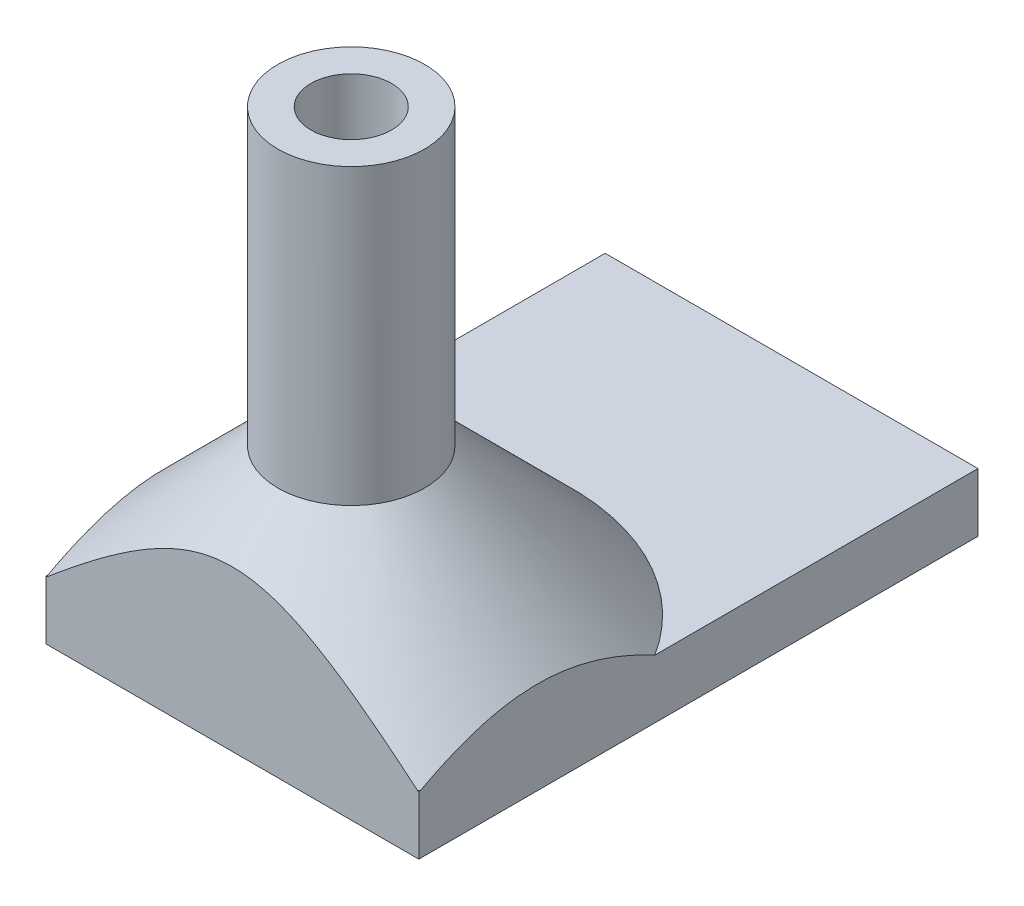
ISO-10303-21;
HEADER;
FILE_DESCRIPTION(('STEP AP214'),'2;1');
FILE_NAME('part.step','',(''),(''),'','','');
FILE_SCHEMA(('AUTOMOTIVE_DESIGN { 1 0 10303 214 1 1 1 1 }'));
ENDSEC;
DATA;
#1=APPLICATION_CONTEXT('core data for automotive mechanical design processes');
#2=APPLICATION_PROTOCOL_DEFINITION('international standard','automotive_design',2000,#1);
#3=PRODUCT_CONTEXT('',#1,'mechanical');
#4=PRODUCT('Part','Part','',(#3));
#5=PRODUCT_RELATED_PRODUCT_CATEGORY('part','',(#4));
#6=PRODUCT_DEFINITION_FORMATION('','',#4);
#7=PRODUCT_DEFINITION_CONTEXT('part definition',#1,'design');
#8=PRODUCT_DEFINITION('design','',#6,#7);
#9=PRODUCT_DEFINITION_SHAPE('','',#8);
#10=(LENGTH_UNIT() NAMED_UNIT(*) SI_UNIT(.MILLI.,.METRE.));
#11=(NAMED_UNIT(*) PLANE_ANGLE_UNIT() SI_UNIT($,.RADIAN.));
#12=(NAMED_UNIT(*) SI_UNIT($,.STERADIAN.) SOLID_ANGLE_UNIT());
#13=UNCERTAINTY_MEASURE_WITH_UNIT(LENGTH_MEASURE(1.E-05),#10,'distance_accuracy_value','');
#14=(GEOMETRIC_REPRESENTATION_CONTEXT(3) GLOBAL_UNCERTAINTY_ASSIGNED_CONTEXT((#13)) GLOBAL_UNIT_ASSIGNED_CONTEXT((#10,
#11,#12)) REPRESENTATION_CONTEXT('',''));
#15=CARTESIAN_POINT('',(0.,0.,0.));
#16=DIRECTION('',(0.,0.,1.));
#17=DIRECTION('',(1.,0.,0.));
#18=AXIS2_PLACEMENT_3D('',#15,#16,#17);
#19=CARTESIAN_POINT('',(0.,4.,0.));
#20=DIRECTION('',(0.,1.,0.));
#21=DIRECTION('',(0.,0.,1.));
#22=AXIS2_PLACEMENT_3D('',#19,#20,#21);
#23=PLANE('',#22);
#24=DIRECTION('',(1.,0.,0.));
#25=VECTOR('',#24,1.);
#26=CARTESIAN_POINT('',(-12.7,4.,19.05));
#27=LINE('',#26,#25);
#28=CARTESIAN_POINT('',(-12.7,4.,19.05));
#29=VERTEX_POINT('',#28);
#30=CARTESIAN_POINT('',(-12.6270183866441,4.,19.05));
#31=VERTEX_POINT('',#30);
#32=EDGE_CURVE('E182',#29,#31,#27,.T.);
#33=ORIENTED_EDGE('',*,*,#32,.T.);
#34=CARTESIAN_POINT('',(0.,4.,10.9531854002114));
#35=DIRECTION('',(0.,1.,0.));
#36=DIRECTION('',(0.,0.,1.));
#37=AXIS2_PLACEMENT_3D('',#34,#35,#36);
#38=CIRCLE('',#37,15.);
#39=CARTESIAN_POINT('',(-12.7,4.,18.9350398213343));
#40=VERTEX_POINT('',#39);
#41=EDGE_CURVE('E134',#31,#40,#38,.F.);
#42=ORIENTED_EDGE('',*,*,#41,.T.);
#43=DIRECTION('',(0.,0.,1.));
#44=VECTOR('',#43,1.);
#45=CARTESIAN_POINT('',(-12.7,4.,-19.05));
#46=LINE('',#45,#44);
#47=EDGE_CURVE('E118',#40,#29,#46,.T.);
#48=ORIENTED_EDGE('',*,*,#47,.T.);
#49=EDGE_LOOP('',(#33,#42,#48));
#50=FACE_BOUND('',#49,.T.);
#51=ADVANCED_FACE('F33',(#50),#23,.T.);
#52=CARTESIAN_POINT('',(-12.7,4.,-19.05));
#53=VERTEX_POINT('',#52);
#54=CARTESIAN_POINT('',(-12.7,4.,2.97133097908851));
#55=VERTEX_POINT('',#54);
#56=EDGE_CURVE('E184',#53,#55,#46,.T.);
#57=ORIENTED_EDGE('',*,*,#56,.T.);
#58=CARTESIAN_POINT('',(0.,4.,10.9531854002114));
#59=DIRECTION('',(0.,1.,0.));
#60=DIRECTION('',(0.,0.,1.));
#61=AXIS2_PLACEMENT_3D('',#58,#59,#60);
#62=CIRCLE('',#61,15.);
#63=CARTESIAN_POINT('',(12.7,4.,2.97133097908851));
#64=VERTEX_POINT('',#63);
#65=EDGE_CURVE('E103',#55,#64,#62,.F.);
#66=ORIENTED_EDGE('',*,*,#65,.T.);
#67=DIRECTION('',(0.,0.,-1.));
#68=VECTOR('',#67,1.);
#69=CARTESIAN_POINT('',(12.7,4.,-19.05));
#70=LINE('',#69,#68);
#71=CARTESIAN_POINT('',(12.7,4.,-19.05));
#72=VERTEX_POINT('',#71);
#73=EDGE_CURVE('E96',#64,#72,#70,.T.);
#74=ORIENTED_EDGE('',*,*,#73,.T.);
#75=DIRECTION('',(-1.,0.,0.));
#76=VECTOR('',#75,1.);
#77=CARTESIAN_POINT('',(-12.7,4.,-19.05));
#78=LINE('',#77,#76);
#79=EDGE_CURVE('E100',#72,#53,#78,.T.);
#80=ORIENTED_EDGE('',*,*,#79,.T.);
#81=EDGE_LOOP('',(#57,#66,#74,#80));
#82=FACE_BOUND('',#81,.T.);
#83=ADVANCED_FACE('F99',(#82),#23,.T.);
#84=CARTESIAN_POINT('',(12.7,4.,-19.05));
#85=DIRECTION('',(-1.,0.,0.));
#86=DIRECTION('',(0.,0.,1.));
#87=AXIS2_PLACEMENT_3D('',#84,#85,#86);
#88=PLANE('',#87);
#89=DIRECTION('',(0.,0.,-1.));
#90=VECTOR('',#89,1.);
#91=CARTESIAN_POINT('',(12.7,0.,-19.05));
#92=LINE('',#91,#90);
#93=CARTESIAN_POINT('',(12.7,0.,19.05));
#94=VERTEX_POINT('',#93);
#95=CARTESIAN_POINT('',(12.7,0.,-19.05));
#96=VERTEX_POINT('',#95);
#97=EDGE_CURVE('E123',#94,#96,#92,.T.);
#98=ORIENTED_EDGE('',*,*,#97,.T.);
#99=DIRECTION('',(0.,-1.,0.));
#100=VECTOR('',#99,1.);
#101=CARTESIAN_POINT('',(12.7,4.,-19.05));
#102=LINE('',#101,#100);
#103=EDGE_CURVE('E113',#72,#96,#102,.T.);
#104=ORIENTED_EDGE('',*,*,#103,.F.);
#105=ORIENTED_EDGE('',*,*,#73,.F.);
#106=CARTESIAN_POINT('',(12.7,4.,2.97133097908851));
#107=CARTESIAN_POINT('',(12.7,4.11879831329429,3.19461421196744));
#108=CARTESIAN_POINT('',(12.7,4.23484506345828,3.41938427218611));
#109=CARTESIAN_POINT('',(12.7,4.4606554763704,3.87214172238079));
#110=CARTESIAN_POINT('',(12.7,4.57041717480401,4.1001300907464));
#111=CARTESIAN_POINT('',(12.7,4.78321780729828,4.56032703695149));
#112=CARTESIAN_POINT('',(12.7,4.88622878144901,4.79254862896782));
#113=CARTESIAN_POINT('',(12.7,5.08407999046719,5.26040113205321));
#114=CARTESIAN_POINT('',(12.7,5.178920916533,5.49603175273953));
#115=CARTESIAN_POINT('',(12.7,5.4485923024589,6.20544051850337));
#116=CARTESIAN_POINT('',(12.7,5.60990459683791,6.68456374447272));
#117=CARTESIAN_POINT('',(12.7,5.81773263879009,7.41253771235371));
#118=CARTESIAN_POINT('',(12.7,5.88129100265059,7.65659645744167));
#119=CARTESIAN_POINT('',(12.7,5.99598908895247,8.14760297454775));
#120=CARTESIAN_POINT('',(12.7,6.04713021106915,8.39455041765867));
#121=CARTESIAN_POINT('',(12.7,6.15862033107275,9.01752801523559));
#122=CARTESIAN_POINT('',(12.7,6.21035977359965,9.39514855504708));
#123=CARTESIAN_POINT('',(12.7,6.28045307895177,10.1535477725309));
#124=CARTESIAN_POINT('',(12.7,6.29880286671071,10.5343268299908));
#125=CARTESIAN_POINT('',(12.7,6.30108322360981,11.2959738274899));
#126=CARTESIAN_POINT('',(12.7,6.28501523629468,11.6768417631315));
#127=CARTESIAN_POINT('',(12.7,6.21936226932965,12.4356039165059));
#128=CARTESIAN_POINT('',(12.7,6.16978168115436,12.8134985173003));
#129=CARTESIAN_POINT('',(12.7,6.06117384482156,13.4400936613952));
#130=CARTESIAN_POINT('',(12.7,6.01064918014109,13.690315805911));
#131=CARTESIAN_POINT('',(12.7,5.89678162829107,14.1878358858792));
#132=CARTESIAN_POINT('',(12.7,5.83343735818068,14.4351335027933));
#133=CARTESIAN_POINT('',(12.7,5.62568871144362,15.1727823582914));
#134=CARTESIAN_POINT('',(12.7,5.46368399317052,15.6582535475034));
#135=CARTESIAN_POINT('',(12.7,5.19207197317861,16.3770784873046));
#136=CARTESIAN_POINT('',(12.7,5.09639541647257,16.6159129313349));
#137=CARTESIAN_POINT('',(12.7,4.89662087872876,17.0900822798772));
#138=CARTESIAN_POINT('',(12.7,4.79252215091557,17.3254168718701));
#139=CARTESIAN_POINT('',(12.7,4.57735946998957,17.7916949650412));
#140=CARTESIAN_POINT('',(12.7,4.46632560661088,18.0226524450129));
#141=CARTESIAN_POINT('',(12.7,4.23780014269328,18.4812608954981));
#142=CARTESIAN_POINT('',(12.7,4.12031065229029,18.7089129160598));
#143=CARTESIAN_POINT('',(12.7,4.,18.9350398213343));
#144=B_SPLINE_CURVE_WITH_KNOTS('',3,(#106,#107,#108,#109,#110,#111,#112,#113,#114,#115,#116,
#117,#118,#119,#120,#121,#122,#123,#124,#125,#126,#127,#128,#129,#130,#131,#132,#133,#134,#135,
#136,#137,#138,#139,#140,#141,#142,#143),.UNSPECIFIED.,.F.,.F.,(4,2,2,2,2,2,2,2,2,2,2,2,2,2,2,2,
2,2,4),(0.,0.758768175132964,1.51777221376502,2.27974354303531,3.04165034494511,
4.55610413540636,5.31243480913116,6.06868018941054,7.21067700994493,8.35281319701974,
9.49490148174295,10.6368401367894,11.4023221009696,12.1678866871238,13.7009468957224,
14.4727026044536,15.2445268182218,16.0132080396626,16.7816394816873),.UNSPECIFIED.);
#145=CARTESIAN_POINT('',(12.7,4.,18.9350398213343));
#146=VERTEX_POINT('',#145);
#147=EDGE_CURVE('E46',#64,#146,#144,.T.);
#148=ORIENTED_EDGE('',*,*,#147,.T.);
#149=CARTESIAN_POINT('',(12.7,4.,19.05));
#150=VERTEX_POINT('',#149);
#151=EDGE_CURVE('E107',#150,#146,#70,.T.);
#152=ORIENTED_EDGE('',*,*,#151,.F.);
#153=DIRECTION('',(0.,-1.,0.));
#154=VECTOR('',#153,1.);
#155=CARTESIAN_POINT('',(12.7,4.,19.05));
#156=LINE('',#155,#154);
#157=EDGE_CURVE('E188',#150,#94,#156,.T.);
#158=ORIENTED_EDGE('',*,*,#157,.T.);
#159=EDGE_LOOP('',(#98,#104,#105,#148,#152,#158));
#160=FACE_BOUND('',#159,.T.);
#161=ADVANCED_FACE('F120',(#160),#88,.F.);
#162=CARTESIAN_POINT('',(-12.7,4.,-19.05));
#163=DIRECTION('',(0.,0.,1.));
#164=DIRECTION('',(1.,0.,0.));
#165=AXIS2_PLACEMENT_3D('',#162,#163,#164);
#166=PLANE('',#165);
#167=DIRECTION('',(-1.,0.,0.));
#168=VECTOR('',#167,1.);
#169=CARTESIAN_POINT('',(-12.7,0.,-19.05));
#170=LINE('',#169,#168);
#171=CARTESIAN_POINT('',(-12.7,0.,-19.05));
#172=VERTEX_POINT('',#171);
#173=EDGE_CURVE('E190',#96,#172,#170,.T.);
#174=ORIENTED_EDGE('',*,*,#173,.T.);
#175=DIRECTION('',(0.,-1.,0.));
#176=VECTOR('',#175,1.);
#177=CARTESIAN_POINT('',(-12.7,4.,-19.05));
#178=LINE('',#177,#176);
#179=EDGE_CURVE('E116',#53,#172,#178,.T.);
#180=ORIENTED_EDGE('',*,*,#179,.F.);
#181=ORIENTED_EDGE('',*,*,#79,.F.);
#182=ORIENTED_EDGE('',*,*,#103,.T.);
#183=EDGE_LOOP('',(#174,#180,#181,#182));
#184=FACE_BOUND('',#183,.T.);
#185=ADVANCED_FACE('F112',(#184),#166,.F.);
#186=CARTESIAN_POINT('',(-12.7,4.,-19.05));
#187=DIRECTION('',(1.,0.,0.));
#188=DIRECTION('',(0.,0.,-1.));
#189=AXIS2_PLACEMENT_3D('',#186,#187,#188);
#190=PLANE('',#189);
#191=DIRECTION('',(0.,0.,1.));
#192=VECTOR('',#191,1.);
#193=CARTESIAN_POINT('',(-12.7,0.,-19.05));
#194=LINE('',#193,#192);
#195=CARTESIAN_POINT('',(-12.7,0.,19.05));
#196=VERTEX_POINT('',#195);
#197=EDGE_CURVE('E193',#172,#196,#194,.T.);
#198=ORIENTED_EDGE('',*,*,#197,.T.);
#199=DIRECTION('',(0.,-1.,0.));
#200=VECTOR('',#199,1.);
#201=CARTESIAN_POINT('',(-12.7,4.,19.05));
#202=LINE('',#201,#200);
#203=EDGE_CURVE('E128',#29,#196,#202,.T.);
#204=ORIENTED_EDGE('',*,*,#203,.F.);
#205=ORIENTED_EDGE('',*,*,#47,.F.);
#206=CARTESIAN_POINT('',(-12.7,4.,18.9350398213343));
#207=CARTESIAN_POINT('',(-12.7,4.11879831329429,18.7117565884554));
#208=CARTESIAN_POINT('',(-12.7,4.23484506345828,18.4869865282367));
#209=CARTESIAN_POINT('',(-12.7,4.4606554763704,18.034229078042));
#210=CARTESIAN_POINT('',(-12.7,4.57041717480402,17.8062407096764));
#211=CARTESIAN_POINT('',(-12.7,4.78321780729828,17.3460437634713));
#212=CARTESIAN_POINT('',(-12.7,4.88622878144902,17.113822171455));
#213=CARTESIAN_POINT('',(-12.7,5.08407999046719,16.6459696683696));
#214=CARTESIAN_POINT('',(-12.7,5.178920916533,16.4103390476833));
#215=CARTESIAN_POINT('',(-12.7,5.4485923024589,15.7009302819194));
#216=CARTESIAN_POINT('',(-12.7,5.60990459683791,15.2218070559501));
#217=CARTESIAN_POINT('',(-12.7,5.8177326387901,14.4938330880691));
#218=CARTESIAN_POINT('',(-12.7,5.88129100265059,14.2497743429811));
#219=CARTESIAN_POINT('',(-12.7,5.99598908895247,13.758767825875));
#220=CARTESIAN_POINT('',(-12.7,6.04713021106915,13.5118203827641));
#221=CARTESIAN_POINT('',(-12.7,6.15862033107275,12.8888427851872));
#222=CARTESIAN_POINT('',(-12.7,6.21035977359966,12.5112222453757));
#223=CARTESIAN_POINT('',(-12.7,6.28045307895177,11.7528230278919));
#224=CARTESIAN_POINT('',(-12.7,6.29880286671071,11.372043970432));
#225=CARTESIAN_POINT('',(-12.7,6.30108322360981,10.6103969729329));
#226=CARTESIAN_POINT('',(-12.7,6.28501523629469,10.2295290372913));
#227=CARTESIAN_POINT('',(-12.7,6.21936226932965,9.47076688391687));
#228=CARTESIAN_POINT('',(-12.7,6.16978168115436,9.09287228312248));
#229=CARTESIAN_POINT('',(-12.7,6.06117384482157,8.4662771390276));
#230=CARTESIAN_POINT('',(-12.7,6.01064918014109,8.2160549945118));
#231=CARTESIAN_POINT('',(-12.7,5.89678162829108,7.7185349145436));
#232=CARTESIAN_POINT('',(-12.7,5.83343735818069,7.47123729762953));
#233=CARTESIAN_POINT('',(-12.7,5.62568871144363,6.73358844213139));
#234=CARTESIAN_POINT('',(-12.7,5.46368399317052,6.24811725291944));
#235=CARTESIAN_POINT('',(-12.7,5.19207197317862,5.52929231311817));
#236=CARTESIAN_POINT('',(-12.7,5.09639541647258,5.29045786908789));
#237=CARTESIAN_POINT('',(-12.7,4.89662087872876,4.8162885205456));
#238=CARTESIAN_POINT('',(-12.7,4.79252215091557,4.58095392855269));
#239=CARTESIAN_POINT('',(-12.7,4.57735946998957,4.11467583538161));
#240=CARTESIAN_POINT('',(-12.7,4.46632560661088,3.88371835540984));
#241=CARTESIAN_POINT('',(-12.7,4.23780014269328,3.42510990492468));
#242=CARTESIAN_POINT('',(-12.7,4.12031065229028,3.19745788436297));
#243=CARTESIAN_POINT('',(-12.7,4.,2.97133097908851));
#244=B_SPLINE_CURVE_WITH_KNOTS('',3,(#206,#207,#208,#209,#210,#211,#212,#213,#214,#215,#216,
#217,#218,#219,#220,#221,#222,#223,#224,#225,#226,#227,#228,#229,#230,#231,#232,#233,#234,#235,
#236,#237,#238,#239,#240,#241,#242,#243),.UNSPECIFIED.,.F.,.F.,(4,2,2,2,2,2,2,2,2,2,2,2,2,2,2,2,
2,2,4),(0.,0.758768175132962,1.51777221376502,2.27974354303532,3.04165034494511,
4.55610413540637,5.31243480913116,6.06868018941055,7.21067700994493,8.35281319701974,
9.49490148174295,10.6368401367894,11.4023221009696,12.1678866871238,13.7009468957224,
14.4727026044536,15.2445268182218,16.0132080396626,16.7816394816873),.UNSPECIFIED.);
#245=EDGE_CURVE('E137',#40,#55,#244,.T.);
#246=ORIENTED_EDGE('',*,*,#245,.T.);
#247=ORIENTED_EDGE('',*,*,#56,.F.);
#248=ORIENTED_EDGE('',*,*,#179,.T.);
#249=EDGE_LOOP('',(#198,#204,#205,#246,#247,#248));
#250=FACE_BOUND('',#249,.T.);
#251=ADVANCED_FACE('F145',(#250),#190,.F.);
#252=CARTESIAN_POINT('',(-12.7,4.,19.05));
#253=DIRECTION('',(0.,0.,-1.));
#254=DIRECTION('',(-1.,0.,0.));
#255=AXIS2_PLACEMENT_3D('',#252,#253,#254);
#256=PLANE('',#255);
#257=DIRECTION('',(1.,0.,0.));
#258=VECTOR('',#257,1.);
#259=CARTESIAN_POINT('',(-12.7,0.,19.05));
#260=LINE('',#259,#258);
#261=EDGE_CURVE('E108',#196,#94,#260,.T.);
#262=ORIENTED_EDGE('',*,*,#261,.T.);
#263=ORIENTED_EDGE('',*,*,#157,.F.);
#264=CARTESIAN_POINT('',(12.6270183866441,4.,19.05));
#265=VERTEX_POINT('',#264);
#266=EDGE_CURVE('E175',#265,#150,#27,.T.);
#267=ORIENTED_EDGE('',*,*,#266,.F.);
#268=CARTESIAN_POINT('',(12.6270183866441,4.,19.05));
#269=CARTESIAN_POINT('',(12.4301986351489,4.16567498087172,19.05));
#270=CARTESIAN_POINT('',(12.2328295204794,4.33069967643433,19.05));
#271=CARTESIAN_POINT('',(11.8368430843775,4.65925437472761,19.05));
#272=CARTESIAN_POINT('',(11.6382257315439,4.82278433960021,19.05));
#273=CARTESIAN_POINT('',(11.2394758595673,5.14825105694935,19.05));
#274=CARTESIAN_POINT('',(11.0393424530342,5.31018672416402,19.05));
#275=CARTESIAN_POINT('',(10.6375137612567,5.63210232335967,19.05));
#276=CARTESIAN_POINT('',(10.4358184836161,5.79208226485221,19.05));
#277=CARTESIAN_POINT('',(9.81145039648525,6.28174086483802,19.05));
#278=CARTESIAN_POINT('',(9.38584131129413,6.60771504107951,19.05));
#279=CARTESIAN_POINT('',(8.74010112998196,7.08668392440498,19.05));
#280=CARTESIAN_POINT('',(8.52365822186039,7.24465750790477,19.05));
#281=CARTESIAN_POINT('',(8.08794814637648,7.5566551846335,19.05));
#282=CARTESIAN_POINT('',(7.86868107855645,7.71067941649488,19.05));
#283=CARTESIAN_POINT('',(7.42619594769544,8.01451666390926,19.05));
#284=CARTESIAN_POINT('',(7.20296739672153,8.16431444192938,19.05));
#285=CARTESIAN_POINT('',(6.75277402177997,8.4582127141519,19.05));
#286=CARTESIAN_POINT('',(6.52580914108756,8.6023131217439,19.05));
#287=CARTESIAN_POINT('',(6.06735946326473,8.88375205101913,19.05));
#288=CARTESIAN_POINT('',(5.83586990736665,9.02108285188099,19.05));
#289=CARTESIAN_POINT('',(5.3680457159679,9.28726023592554,19.05));
#290=CARTESIAN_POINT('',(5.13171120134571,9.41610703044148,19.05));
#291=CARTESIAN_POINT('',(4.65770675546008,9.66125260858413,19.05));
#292=CARTESIAN_POINT('',(4.4201289743695,9.77772846672598,19.05));
#293=CARTESIAN_POINT('',(3.93922091890425,9.99832143213981,19.05));
#294=CARTESIAN_POINT('',(3.69588992251301,10.10243697824,19.05));
#295=CARTESIAN_POINT('',(3.20377896583001,10.2953172266951,19.05));
#296=CARTESIAN_POINT('',(2.95501226250881,10.384115405934,19.05));
#297=CARTESIAN_POINT('',(2.45177157754621,10.5434817729774,19.05));
#298=CARTESIAN_POINT('',(2.19730053916032,10.6140591370915,19.05));
#299=CARTESIAN_POINT('',(1.68139251807386,10.7342777605666,19.05));
#300=CARTESIAN_POINT('',(1.41991790501084,10.7837601096701,19.05));
#301=CARTESIAN_POINT('',(0.893465526372912,10.8582030418904,19.05));
#302=CARTESIAN_POINT('',(0.62848812909438,10.883166182593,19.05));
#303=CARTESIAN_POINT('',(0.0978604124479058,10.9069230067117,19.05));
#304=CARTESIAN_POINT('',(-0.167787572380951,10.905767850938,19.05));
#305=CARTESIAN_POINT('',(-0.697695337629532,10.877491190602,19.05));
#306=CARTESIAN_POINT('',(-0.961954990150039,10.8503673344495,19.05));
#307=CARTESIAN_POINT('',(-1.48350860925618,10.7723951039124,19.05));
#308=CARTESIAN_POINT('',(-1.74084835319272,10.7218473112991,19.05));
#309=CARTESIAN_POINT('',(-2.25048215740719,10.5998930108483,19.05));
#310=CARTESIAN_POINT('',(-2.5027757392529,10.5284845351089,19.05));
#311=CARTESIAN_POINT('',(-3.00457730940931,10.3669969030147,19.05));
#312=CARTESIAN_POINT('',(-3.2540163585444,10.2767055554952,19.05));
#313=CARTESIAN_POINT('',(-3.6236103587418,10.1300407429397,19.05));
#314=CARTESIAN_POINT('',(-3.74604087438838,10.0792843273184,19.05));
#315=CARTESIAN_POINT('',(-3.98943887719913,9.97437137530026,19.05));
#316=CARTESIAN_POINT('',(-4.110406362764,9.92021483518705,19.05));
#317=CARTESIAN_POINT('',(-4.43169424086247,9.77142728310921,19.05));
#318=CARTESIAN_POINT('',(-4.63074111294328,9.67404266406564,19.05));
#319=CARTESIAN_POINT('',(-5.02515103871264,9.47204846010083,19.05));
#320=CARTESIAN_POINT('',(-5.22051347842801,9.36743768432249,19.05));
#321=CARTESIAN_POINT('',(-5.6079625847834,9.15207154960092,19.05));
#322=CARTESIAN_POINT('',(-5.80004724980676,9.04131260021478,19.05));
#323=CARTESIAN_POINT('',(-6.18115478481811,8.81463545255345,19.05));
#324=CARTESIAN_POINT('',(-6.37017742500611,8.69871686948035,19.05));
#325=CARTESIAN_POINT('',(-6.93460026791715,8.34349534643708,19.05));
#326=CARTESIAN_POINT('',(-7.30584363737169,8.09758258992573,19.05));
#327=CARTESIAN_POINT('',(-8.03933204819067,7.59304620968432,19.05));
#328=CARTESIAN_POINT('',(-8.40157975246539,7.33442641669271,19.05));
#329=CARTESIAN_POINT('',(-9.09356126804736,6.82625146957009,19.05));
#330=CARTESIAN_POINT('',(-9.42377949836798,6.57735346830241,19.05));
#331=CARTESIAN_POINT('',(-10.0792479048758,6.07305670198447,19.05));
#332=CARTESIAN_POINT('',(-10.4044976145146,5.81765733238142,19.05));
#333=CARTESIAN_POINT('',(-11.0478779292461,5.30413510941913,19.05));
#334=CARTESIAN_POINT('',(-11.3660466377947,5.04605986165322,19.05));
#335=CARTESIAN_POINT('',(-11.9989366223818,4.52585421835795,19.05));
#336=CARTESIAN_POINT('',(-12.3136586463091,4.26372473357024,19.05));
#337=CARTESIAN_POINT('',(-12.6270183866441,4.,19.05));
#338=B_SPLINE_CURVE_WITH_KNOTS('',3,(#268,#269,#270,#271,#272,#273,#274,#275,#276,#277,#278,
#279,#280,#281,#282,#283,#284,#285,#286,#287,#288,#289,#290,#291,#292,#293,#294,#295,#296,#297,
#298,#299,#300,#301,#302,#303,#304,#305,#306,#307,#308,#309,#310,#311,#312,#313,#314,#315,#316,
#317,#318,#319,#320,#321,#322,#323,#324,#325,#326,#327,#328,#329,#330,#331,#332,#333,#334,#335,
#336,#337),.UNSPECIFIED.,.F.,.F.,(4,2,2,2,2,2,2,2,2,2,2,2,2,2,2,2,2,2,2,2,2,2,2,2,2,2,2,2,2,2,2,
2,2,2,4),(0.,0.771801050496476,1.54362159505759,2.31593551556753,3.08824567847805,
4.69630979132508,5.50015991023256,6.30398177319154,7.1104043625803,7.91683920634987,
8.72417347195164,9.53148761956085,10.3249788777173,11.1185702515651,11.9104045891112,
12.7018393641786,13.4991350147883,14.2963474910731,15.0919985142036,15.8877215941588,
16.6735050749848,17.4593627069995,18.2545777044435,18.6521407193691,19.0497041688479,
19.7142949713106,20.3789955595971,21.0440884927706,21.7092311109811,23.0447223930314,
24.3798135110562,25.6202561867406,26.8608146338111,28.0898047581161,29.3185227009999),.UNSPECIFIED.);
#339=EDGE_CURVE('E11',#265,#31,#338,.T.);
#340=ORIENTED_EDGE('',*,*,#339,.T.);
#341=ORIENTED_EDGE('',*,*,#32,.F.);
#342=ORIENTED_EDGE('',*,*,#203,.T.);
#343=EDGE_LOOP('',(#262,#263,#267,#340,#341,#342));
#344=FACE_BOUND('',#343,.T.);
#345=ADVANCED_FACE('F149',(#344),#256,.F.);
#346=ORIENTED_EDGE('',*,*,#151,.T.);
#347=CARTESIAN_POINT('',(0.,4.,10.9531854002114));
#348=DIRECTION('',(0.,1.,0.));
#349=DIRECTION('',(0.,0.,1.));
#350=AXIS2_PLACEMENT_3D('',#347,#348,#349);
#351=CIRCLE('',#350,15.);
#352=EDGE_CURVE('E53',#146,#265,#351,.F.);
#353=ORIENTED_EDGE('',*,*,#352,.T.);
#354=ORIENTED_EDGE('',*,*,#266,.T.);
#355=EDGE_LOOP('',(#346,#353,#354));
#356=FACE_BOUND('',#355,.T.);
#357=ADVANCED_FACE('F160',(#356),#23,.T.);
#358=CARTESIAN_POINT('',(0.,0.,0.));
#359=DIRECTION('',(0.,1.,0.));
#360=DIRECTION('',(0.,0.,1.));
#361=AXIS2_PLACEMENT_3D('',#358,#359,#360);
#362=PLANE('',#361);
#363=CARTESIAN_POINT('',(0.,0.,10.9531854002114));
#364=DIRECTION('',(0.,1.,0.));
#365=DIRECTION('',(0.,0.,1.));
#366=AXIS2_PLACEMENT_3D('',#363,#364,#365);
#367=CIRCLE('',#366,2.75);
#368=CARTESIAN_POINT('',(0.,0.,13.7031854002114));
#369=VERTEX_POINT('',#368);
#370=EDGE_CURVE('E200',#369,#369,#367,.T.);
#371=ORIENTED_EDGE('',*,*,#370,.T.);
#372=EDGE_LOOP('',(#371));
#373=FACE_BOUND('',#372,.T.);
#374=ORIENTED_EDGE('',*,*,#97,.F.);
#375=ORIENTED_EDGE('',*,*,#261,.F.);
#376=ORIENTED_EDGE('',*,*,#197,.F.);
#377=ORIENTED_EDGE('',*,*,#173,.F.);
#378=EDGE_LOOP('',(#374,#375,#376,#377));
#379=FACE_BOUND('',#378,.T.);
#380=ADVANCED_FACE('F167',(#373,#379),#362,.F.);
#381=CARTESIAN_POINT('',(0.,34.,10.9531854002114));
#382=DIRECTION('',(0.,-1.,0.));
#383=DIRECTION('',(0.,0.,-1.));
#384=AXIS2_PLACEMENT_3D('',#381,#382,#383);
#385=CYLINDRICAL_SURFACE('',#384,5.);
#386=CARTESIAN_POINT('',(0.,14.0000000000001,10.9531854002114));
#387=DIRECTION('',(0.,1.,0.));
#388=DIRECTION('',(0.,0.,1.));
#389=AXIS2_PLACEMENT_3D('',#386,#387,#388);
#390=CIRCLE('',#389,5.);
#391=CARTESIAN_POINT('',(0.,14.0000000000001,15.9531854002114));
#392=VERTEX_POINT('',#391);
#393=EDGE_CURVE('E124',#392,#392,#390,.T.);
#394=ORIENTED_EDGE('',*,*,#393,.T.);
#395=EDGE_LOOP('',(#394));
#396=FACE_BOUND('',#395,.T.);
#397=CARTESIAN_POINT('',(0.,34.,10.9531854002114));
#398=DIRECTION('',(0.,1.,0.));
#399=DIRECTION('',(0.,0.,1.));
#400=AXIS2_PLACEMENT_3D('',#397,#398,#399);
#401=CIRCLE('',#400,5.);
#402=CARTESIAN_POINT('',(0.,34.,15.9531854002114));
#403=VERTEX_POINT('',#402);
#404=EDGE_CURVE('E191',#403,#403,#401,.T.);
#405=ORIENTED_EDGE('',*,*,#404,.F.);
#406=EDGE_LOOP('',(#405));
#407=FACE_BOUND('',#406,.T.);
#408=ADVANCED_FACE('F172',(#396,#407),#385,.T.);
#409=CARTESIAN_POINT('',(0.,34.,10.9531854002114));
#410=DIRECTION('',(0.,1.,0.));
#411=DIRECTION('',(0.,0.,1.));
#412=AXIS2_PLACEMENT_3D('',#409,#410,#411);
#413=PLANE('',#412);
#414=CARTESIAN_POINT('',(0.,34.,10.9531854002114));
#415=DIRECTION('',(0.,1.,0.));
#416=DIRECTION('',(0.,0.,1.));
#417=AXIS2_PLACEMENT_3D('',#414,#415,#416);
#418=CIRCLE('',#417,2.75);
#419=CARTESIAN_POINT('',(0.,34.,13.7031854002114));
#420=VERTEX_POINT('',#419);
#421=EDGE_CURVE('E205',#420,#420,#418,.T.);
#422=ORIENTED_EDGE('',*,*,#421,.F.);
#423=EDGE_LOOP('',(#422));
#424=FACE_BOUND('',#423,.T.);
#425=ORIENTED_EDGE('',*,*,#404,.T.);
#426=EDGE_LOOP('',(#425));
#427=FACE_BOUND('',#426,.T.);
#428=ADVANCED_FACE('F214',(#424,#427),#413,.T.);
#429=CARTESIAN_POINT('',(0.,-6.,10.9531854002114));
#430=DIRECTION('',(0.,1.,0.));
#431=DIRECTION('',(0.,0.,1.));
#432=AXIS2_PLACEMENT_3D('',#429,#430,#431);
#433=CYLINDRICAL_SURFACE('',#432,2.75);
#434=ORIENTED_EDGE('',*,*,#421,.T.);
#435=EDGE_LOOP('',(#434));
#436=FACE_BOUND('',#435,.T.);
#437=ORIENTED_EDGE('',*,*,#370,.F.);
#438=EDGE_LOOP('',(#437));
#439=FACE_BOUND('',#438,.T.);
#440=ADVANCED_FACE('F211',(#436,#439),#433,.F.);
#441=CARTESIAN_POINT('',(0.,14.0000000000001,10.9531854002114));
#442=DIRECTION('',(0.,-1.,0.));
#443=DIRECTION('',(0.,0.,-1.));
#444=AXIS2_PLACEMENT_3D('',#441,#442,#443);
#445=CONICAL_SURFACE('',#444,5.,0.785398163397443);
#446=ORIENTED_EDGE('',*,*,#245,.F.);
#447=ORIENTED_EDGE('',*,*,#41,.F.);
#448=ORIENTED_EDGE('',*,*,#339,.F.);
#449=ORIENTED_EDGE('',*,*,#352,.F.);
#450=ORIENTED_EDGE('',*,*,#147,.F.);
#451=ORIENTED_EDGE('',*,*,#65,.F.);
#452=EDGE_LOOP('',(#446,#447,#448,#449,#450,#451));
#453=FACE_BOUND('',#452,.T.);
#454=ORIENTED_EDGE('',*,*,#393,.F.);
#455=EDGE_LOOP('',(#454));
#456=FACE_BOUND('',#455,.T.);
#457=ADVANCED_FACE('F35',(#453,#456),#445,.T.);
#458=CLOSED_SHELL('',(#51,#83,#161,#185,#251,#345,#357,#380,#408,#428,#440,#457));
#459=MANIFOLD_SOLID_BREP('B2',#458);
#460=ADVANCED_BREP_SHAPE_REPRESENTATION('',(#18,#459),#14);
#461=SHAPE_DEFINITION_REPRESENTATION(#9,#460);
ENDSEC;
END-ISO-10303-21;
